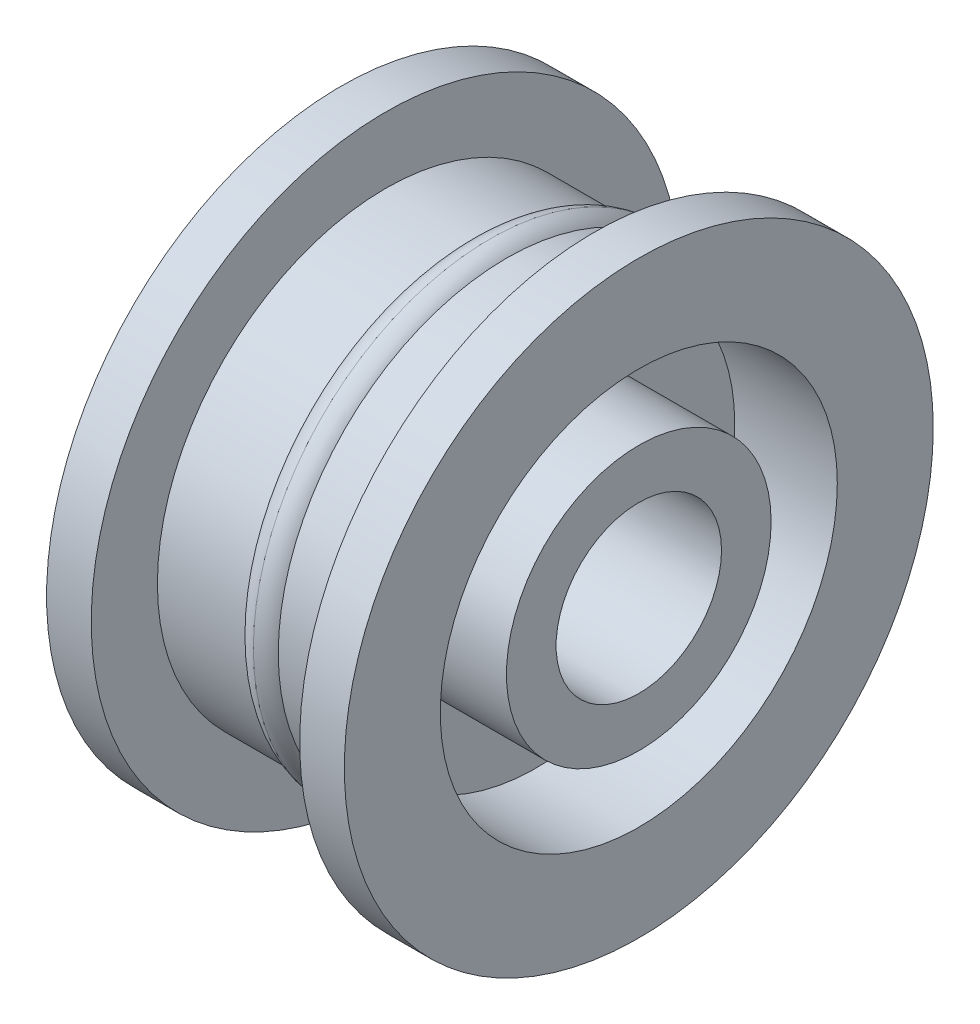
ISO-10303-21;
HEADER;
FILE_DESCRIPTION(('STEP AP214'),'2;1');
FILE_NAME('part.step','',(''),(''),'','','');
FILE_SCHEMA(('AUTOMOTIVE_DESIGN { 1 0 10303 214 1 1 1 1 }'));
ENDSEC;
DATA;
#1=APPLICATION_CONTEXT('core data for automotive mechanical design processes');
#2=APPLICATION_PROTOCOL_DEFINITION('international standard','automotive_design',2000,#1);
#3=PRODUCT_CONTEXT('',#1,'mechanical');
#4=PRODUCT('Part','Part','',(#3));
#5=PRODUCT_RELATED_PRODUCT_CATEGORY('part','',(#4));
#6=PRODUCT_DEFINITION_FORMATION('','',#4);
#7=PRODUCT_DEFINITION_CONTEXT('part definition',#1,'design');
#8=PRODUCT_DEFINITION('design','',#6,#7);
#9=PRODUCT_DEFINITION_SHAPE('','',#8);
#10=(LENGTH_UNIT() NAMED_UNIT(*) SI_UNIT(.MILLI.,.METRE.));
#11=(NAMED_UNIT(*) PLANE_ANGLE_UNIT() SI_UNIT($,.RADIAN.));
#12=(NAMED_UNIT(*) SI_UNIT($,.STERADIAN.) SOLID_ANGLE_UNIT());
#13=UNCERTAINTY_MEASURE_WITH_UNIT(LENGTH_MEASURE(1.E-05),#10,'distance_accuracy_value','');
#14=(GEOMETRIC_REPRESENTATION_CONTEXT(3) GLOBAL_UNCERTAINTY_ASSIGNED_CONTEXT((#13)) GLOBAL_UNIT_ASSIGNED_CONTEXT((#10,
#11,#12)) REPRESENTATION_CONTEXT('',''));
#15=CARTESIAN_POINT('',(0.,0.,0.));
#16=DIRECTION('',(0.,0.,1.));
#17=DIRECTION('',(1.,0.,0.));
#18=AXIS2_PLACEMENT_3D('',#15,#16,#17);
#19=CARTESIAN_POINT('',(0.,0.,0.));
#20=DIRECTION('',(1.,0.,0.));
#21=DIRECTION('',(0.,0.,-1.));
#22=AXIS2_PLACEMENT_3D('',#19,#20,#21);
#23=CYLINDRICAL_SURFACE('',#22,13.8);
#24=CARTESIAN_POINT('',(6.29999999999997,0.,0.));
#25=DIRECTION('',(1.,0.,0.));
#26=DIRECTION('',(0.,0.,-1.));
#27=AXIS2_PLACEMENT_3D('',#24,#25,#26);
#28=CIRCLE('',#27,13.8);
#29=CARTESIAN_POINT('',(6.29999999999997,0.,-13.8));
#30=VERTEX_POINT('',#29);
#31=EDGE_CURVE('E64',#30,#30,#28,.T.);
#32=ORIENTED_EDGE('',*,*,#31,.F.);
#33=EDGE_LOOP('',(#32));
#34=FACE_BOUND('',#33,.T.);
#35=CARTESIAN_POINT('',(1.00623306791414,0.,0.));
#36=DIRECTION('',(-1.,0.,0.));
#37=DIRECTION('',(0.,0.,1.));
#38=AXIS2_PLACEMENT_3D('',#35,#36,#37);
#39=CIRCLE('',#38,13.8);
#40=CARTESIAN_POINT('',(1.00623306791414,0.,13.8));
#41=VERTEX_POINT('',#40);
#42=EDGE_CURVE('E38',#41,#41,#39,.F.);
#43=ORIENTED_EDGE('',*,*,#42,.T.);
#44=EDGE_LOOP('',(#43));
#45=FACE_BOUND('',#44,.T.);
#46=ADVANCED_FACE('F34',(#34,#45),#23,.T.);
#47=CARTESIAN_POINT('',(-6.29999999999997,0.,0.));
#48=DIRECTION('',(1.,0.,0.));
#49=DIRECTION('',(0.,0.,-1.));
#50=AXIS2_PLACEMENT_3D('',#47,#48,#49);
#51=CIRCLE('',#50,13.8);
#52=CARTESIAN_POINT('',(-6.29999999999997,0.,-13.8));
#53=VERTEX_POINT('',#52);
#54=EDGE_CURVE('E56',#53,#53,#51,.T.);
#55=ORIENTED_EDGE('',*,*,#54,.T.);
#56=EDGE_LOOP('',(#55));
#57=FACE_BOUND('',#56,.T.);
#58=CARTESIAN_POINT('',(-1.00623306791414,0.,0.));
#59=DIRECTION('',(1.,0.,0.));
#60=DIRECTION('',(0.,0.,-1.));
#61=AXIS2_PLACEMENT_3D('',#58,#59,#60);
#62=CIRCLE('',#61,13.8);
#63=CARTESIAN_POINT('',(-1.00623306791414,0.,-13.8));
#64=VERTEX_POINT('',#63);
#65=EDGE_CURVE('E50',#64,#64,#62,.F.);
#66=ORIENTED_EDGE('',*,*,#65,.T.);
#67=EDGE_LOOP('',(#66));
#68=FACE_BOUND('',#67,.T.);
#69=ADVANCED_FACE('F120',(#57,#68),#23,.T.);
#70=CARTESIAN_POINT('',(-6.29999999999997,17.8,0.));
#71=DIRECTION('',(1.,0.,0.));
#72=DIRECTION('',(0.,0.,-1.));
#73=AXIS2_PLACEMENT_3D('',#70,#71,#72);
#74=PLANE('',#73);
#75=CARTESIAN_POINT('',(-6.29999999999997,0.,0.));
#76=DIRECTION('',(1.,0.,0.));
#77=DIRECTION('',(0.,0.,-1.));
#78=AXIS2_PLACEMENT_3D('',#75,#76,#77);
#79=CIRCLE('',#78,17.8);
#80=CARTESIAN_POINT('',(-6.29999999999997,0.,-17.8));
#81=VERTEX_POINT('',#80);
#82=EDGE_CURVE('E10',#81,#81,#79,.T.);
#83=ORIENTED_EDGE('',*,*,#82,.T.);
#84=EDGE_LOOP('',(#83));
#85=FACE_BOUND('',#84,.T.);
#86=ORIENTED_EDGE('',*,*,#54,.F.);
#87=EDGE_LOOP('',(#86));
#88=FACE_BOUND('',#87,.T.);
#89=ADVANCED_FACE('F36',(#85,#88),#74,.T.);
#90=CARTESIAN_POINT('',(0.,0.,0.));
#91=DIRECTION('',(1.,0.,0.));
#92=DIRECTION('',(0.,0.,-1.));
#93=AXIS2_PLACEMENT_3D('',#90,#91,#92);
#94=CYLINDRICAL_SURFACE('',#93,17.8);
#95=CARTESIAN_POINT('',(-9.00000000000001,0.,0.));
#96=DIRECTION('',(1.,0.,0.));
#97=DIRECTION('',(0.,0.,-1.));
#98=AXIS2_PLACEMENT_3D('',#95,#96,#97);
#99=CIRCLE('',#98,17.8);
#100=CARTESIAN_POINT('',(-9.00000000000001,0.,-17.8));
#101=VERTEX_POINT('',#100);
#102=EDGE_CURVE('E42',#101,#101,#99,.T.);
#103=ORIENTED_EDGE('',*,*,#102,.T.);
#104=EDGE_LOOP('',(#103));
#105=FACE_BOUND('',#104,.T.);
#106=ORIENTED_EDGE('',*,*,#82,.F.);
#107=EDGE_LOOP('',(#106));
#108=FACE_BOUND('',#107,.T.);
#109=ADVANCED_FACE('F117',(#105,#108),#94,.T.);
#110=CARTESIAN_POINT('',(-9.00000000000001,12.,0.));
#111=DIRECTION('',(-1.,0.,0.));
#112=DIRECTION('',(0.,0.,1.));
#113=AXIS2_PLACEMENT_3D('',#110,#111,#112);
#114=PLANE('',#113);
#115=CARTESIAN_POINT('',(-9.00000000000001,0.,0.));
#116=DIRECTION('',(1.,0.,0.));
#117=DIRECTION('',(0.,0.,-1.));
#118=AXIS2_PLACEMENT_3D('',#115,#116,#117);
#119=CIRCLE('',#118,12.);
#120=CARTESIAN_POINT('',(-9.00000000000001,0.,-12.));
#121=VERTEX_POINT('',#120);
#122=EDGE_CURVE('E47',#121,#121,#119,.T.);
#123=ORIENTED_EDGE('',*,*,#122,.T.);
#124=EDGE_LOOP('',(#123));
#125=FACE_BOUND('',#124,.T.);
#126=ORIENTED_EDGE('',*,*,#102,.F.);
#127=EDGE_LOOP('',(#126));
#128=FACE_BOUND('',#127,.T.);
#129=ADVANCED_FACE('F102',(#125,#128),#114,.T.);
#130=CARTESIAN_POINT('',(0.,0.,0.));
#131=DIRECTION('',(1.,0.,0.));
#132=DIRECTION('',(0.,0.,-1.));
#133=AXIS2_PLACEMENT_3D('',#130,#131,#132);
#134=CYLINDRICAL_SURFACE('',#133,12.);
#135=CARTESIAN_POINT('',(-2.80000000000002,0.,0.));
#136=DIRECTION('',(1.,0.,0.));
#137=DIRECTION('',(0.,0.,-1.));
#138=AXIS2_PLACEMENT_3D('',#135,#136,#137);
#139=CIRCLE('',#138,12.);
#140=CARTESIAN_POINT('',(-2.80000000000002,0.,-12.));
#141=VERTEX_POINT('',#140);
#142=EDGE_CURVE('E97',#141,#141,#139,.T.);
#143=ORIENTED_EDGE('',*,*,#142,.T.);
#144=EDGE_LOOP('',(#143));
#145=FACE_BOUND('',#144,.T.);
#146=ORIENTED_EDGE('',*,*,#122,.F.);
#147=EDGE_LOOP('',(#146));
#148=FACE_BOUND('',#147,.T.);
#149=ADVANCED_FACE('F105',(#145,#148),#134,.F.);
#150=CARTESIAN_POINT('',(-2.80000000000002,8.00000000000001,0.));
#151=DIRECTION('',(-1.,0.,0.));
#152=DIRECTION('',(0.,0.,1.));
#153=AXIS2_PLACEMENT_3D('',#150,#151,#152);
#154=PLANE('',#153);
#155=CARTESIAN_POINT('',(-2.80000000000002,0.,0.));
#156=DIRECTION('',(1.,0.,0.));
#157=DIRECTION('',(0.,0.,-1.));
#158=AXIS2_PLACEMENT_3D('',#155,#156,#157);
#159=CIRCLE('',#158,8.);
#160=CARTESIAN_POINT('',(-2.80000000000002,0.,-7.99999999999999));
#161=VERTEX_POINT('',#160);
#162=EDGE_CURVE('E94',#161,#161,#159,.T.);
#163=ORIENTED_EDGE('',*,*,#162,.T.);
#164=EDGE_LOOP('',(#163));
#165=FACE_BOUND('',#164,.T.);
#166=ORIENTED_EDGE('',*,*,#142,.F.);
#167=EDGE_LOOP('',(#166));
#168=FACE_BOUND('',#167,.T.);
#169=ADVANCED_FACE('F107',(#165,#168),#154,.T.);
#170=CARTESIAN_POINT('',(0.,0.,0.));
#171=DIRECTION('',(1.,0.,0.));
#172=DIRECTION('',(0.,0.,-1.));
#173=AXIS2_PLACEMENT_3D('',#170,#171,#172);
#174=CYLINDRICAL_SURFACE('',#173,8.);
#175=CARTESIAN_POINT('',(-9.00000000000001,0.,0.));
#176=DIRECTION('',(1.,0.,0.));
#177=DIRECTION('',(0.,0.,-1.));
#178=AXIS2_PLACEMENT_3D('',#175,#176,#177);
#179=CIRCLE('',#178,8.);
#180=CARTESIAN_POINT('',(-9.00000000000001,0.,-7.99999999999999));
#181=VERTEX_POINT('',#180);
#182=EDGE_CURVE('E91',#181,#181,#179,.T.);
#183=ORIENTED_EDGE('',*,*,#182,.T.);
#184=EDGE_LOOP('',(#183));
#185=FACE_BOUND('',#184,.T.);
#186=ORIENTED_EDGE('',*,*,#162,.F.);
#187=EDGE_LOOP('',(#186));
#188=FACE_BOUND('',#187,.T.);
#189=ADVANCED_FACE('F114',(#185,#188),#174,.T.);
#190=CARTESIAN_POINT('',(-9.00000000000001,5.00000000000003,0.));
#191=DIRECTION('',(-1.,0.,0.));
#192=DIRECTION('',(0.,0.,1.));
#193=AXIS2_PLACEMENT_3D('',#190,#191,#192);
#194=PLANE('',#193);
#195=CARTESIAN_POINT('',(-9.00000000000001,0.,0.));
#196=DIRECTION('',(1.,0.,0.));
#197=DIRECTION('',(0.,0.,-1.));
#198=AXIS2_PLACEMENT_3D('',#195,#196,#197);
#199=CIRCLE('',#198,5.);
#200=CARTESIAN_POINT('',(-9.00000000000001,0.,-4.99999999999999));
#201=VERTEX_POINT('',#200);
#202=EDGE_CURVE('E88',#201,#201,#199,.T.);
#203=ORIENTED_EDGE('',*,*,#202,.T.);
#204=EDGE_LOOP('',(#203));
#205=FACE_BOUND('',#204,.T.);
#206=ORIENTED_EDGE('',*,*,#182,.F.);
#207=EDGE_LOOP('',(#206));
#208=FACE_BOUND('',#207,.T.);
#209=ADVANCED_FACE('F164',(#205,#208),#194,.T.);
#210=CARTESIAN_POINT('',(0.,0.,0.));
#211=DIRECTION('',(1.,0.,0.));
#212=DIRECTION('',(0.,0.,-1.));
#213=AXIS2_PLACEMENT_3D('',#210,#211,#212);
#214=CYLINDRICAL_SURFACE('',#213,5.);
#215=CARTESIAN_POINT('',(9.00000000000001,0.,0.));
#216=DIRECTION('',(1.,0.,0.));
#217=DIRECTION('',(0.,0.,-1.));
#218=AXIS2_PLACEMENT_3D('',#215,#216,#217);
#219=CIRCLE('',#218,5.);
#220=CARTESIAN_POINT('',(9.00000000000001,0.,-5.));
#221=VERTEX_POINT('',#220);
#222=EDGE_CURVE('E85',#221,#221,#219,.T.);
#223=ORIENTED_EDGE('',*,*,#222,.T.);
#224=EDGE_LOOP('',(#223));
#225=FACE_BOUND('',#224,.T.);
#226=ORIENTED_EDGE('',*,*,#202,.F.);
#227=EDGE_LOOP('',(#226));
#228=FACE_BOUND('',#227,.T.);
#229=ADVANCED_FACE('F160',(#225,#228),#214,.F.);
#230=CARTESIAN_POINT('',(9.00000000000001,5.00000000000003,0.));
#231=DIRECTION('',(1.,0.,0.));
#232=DIRECTION('',(0.,0.,-1.));
#233=AXIS2_PLACEMENT_3D('',#230,#231,#232);
#234=PLANE('',#233);
#235=CARTESIAN_POINT('',(9.00000000000001,0.,0.));
#236=DIRECTION('',(1.,0.,0.));
#237=DIRECTION('',(0.,0.,-1.));
#238=AXIS2_PLACEMENT_3D('',#235,#236,#237);
#239=CIRCLE('',#238,8.);
#240=CARTESIAN_POINT('',(9.00000000000001,0.,-8.));
#241=VERTEX_POINT('',#240);
#242=EDGE_CURVE('E82',#241,#241,#239,.T.);
#243=ORIENTED_EDGE('',*,*,#242,.T.);
#244=EDGE_LOOP('',(#243));
#245=FACE_BOUND('',#244,.T.);
#246=ORIENTED_EDGE('',*,*,#222,.F.);
#247=EDGE_LOOP('',(#246));
#248=FACE_BOUND('',#247,.T.);
#249=ADVANCED_FACE('F156',(#245,#248),#234,.T.);
#250=CARTESIAN_POINT('',(0.,0.,0.));
#251=DIRECTION('',(1.,0.,0.));
#252=DIRECTION('',(0.,0.,-1.));
#253=AXIS2_PLACEMENT_3D('',#250,#251,#252);
#254=CYLINDRICAL_SURFACE('',#253,8.);
#255=CARTESIAN_POINT('',(2.80000000000002,0.,0.));
#256=DIRECTION('',(1.,0.,0.));
#257=DIRECTION('',(0.,0.,-1.));
#258=AXIS2_PLACEMENT_3D('',#255,#256,#257);
#259=CIRCLE('',#258,8.);
#260=CARTESIAN_POINT('',(2.80000000000002,0.,-8.));
#261=VERTEX_POINT('',#260);
#262=EDGE_CURVE('E79',#261,#261,#259,.T.);
#263=ORIENTED_EDGE('',*,*,#262,.T.);
#264=EDGE_LOOP('',(#263));
#265=FACE_BOUND('',#264,.T.);
#266=ORIENTED_EDGE('',*,*,#242,.F.);
#267=EDGE_LOOP('',(#266));
#268=FACE_BOUND('',#267,.T.);
#269=ADVANCED_FACE('F152',(#265,#268),#254,.T.);
#270=CARTESIAN_POINT('',(2.80000000000002,7.99999999999998,0.));
#271=DIRECTION('',(1.,0.,0.));
#272=DIRECTION('',(0.,0.,-1.));
#273=AXIS2_PLACEMENT_3D('',#270,#271,#272);
#274=PLANE('',#273);
#275=CARTESIAN_POINT('',(2.80000000000002,0.,0.));
#276=DIRECTION('',(1.,0.,0.));
#277=DIRECTION('',(0.,0.,-1.));
#278=AXIS2_PLACEMENT_3D('',#275,#276,#277);
#279=CIRCLE('',#278,12.);
#280=CARTESIAN_POINT('',(2.80000000000002,0.,-12.));
#281=VERTEX_POINT('',#280);
#282=EDGE_CURVE('E76',#281,#281,#279,.T.);
#283=ORIENTED_EDGE('',*,*,#282,.T.);
#284=EDGE_LOOP('',(#283));
#285=FACE_BOUND('',#284,.T.);
#286=ORIENTED_EDGE('',*,*,#262,.F.);
#287=EDGE_LOOP('',(#286));
#288=FACE_BOUND('',#287,.T.);
#289=ADVANCED_FACE('F148',(#285,#288),#274,.T.);
#290=CARTESIAN_POINT('',(0.,0.,0.));
#291=DIRECTION('',(1.,0.,0.));
#292=DIRECTION('',(0.,0.,-1.));
#293=AXIS2_PLACEMENT_3D('',#290,#291,#292);
#294=CYLINDRICAL_SURFACE('',#293,12.);
#295=CARTESIAN_POINT('',(9.00000000000001,0.,0.));
#296=DIRECTION('',(1.,0.,0.));
#297=DIRECTION('',(0.,0.,-1.));
#298=AXIS2_PLACEMENT_3D('',#295,#296,#297);
#299=CIRCLE('',#298,12.);
#300=CARTESIAN_POINT('',(9.00000000000001,0.,-12.));
#301=VERTEX_POINT('',#300);
#302=EDGE_CURVE('E73',#301,#301,#299,.T.);
#303=ORIENTED_EDGE('',*,*,#302,.T.);
#304=EDGE_LOOP('',(#303));
#305=FACE_BOUND('',#304,.T.);
#306=ORIENTED_EDGE('',*,*,#282,.F.);
#307=EDGE_LOOP('',(#306));
#308=FACE_BOUND('',#307,.T.);
#309=ADVANCED_FACE('F144',(#305,#308),#294,.F.);
#310=CARTESIAN_POINT('',(9.00000000000001,12.,0.));
#311=DIRECTION('',(1.,0.,0.));
#312=DIRECTION('',(0.,0.,-1.));
#313=AXIS2_PLACEMENT_3D('',#310,#311,#312);
#314=PLANE('',#313);
#315=CARTESIAN_POINT('',(9.00000000000001,0.,0.));
#316=DIRECTION('',(1.,0.,0.));
#317=DIRECTION('',(0.,0.,-1.));
#318=AXIS2_PLACEMENT_3D('',#315,#316,#317);
#319=CIRCLE('',#318,17.8);
#320=CARTESIAN_POINT('',(9.00000000000001,0.,-17.8));
#321=VERTEX_POINT('',#320);
#322=EDGE_CURVE('E70',#321,#321,#319,.T.);
#323=ORIENTED_EDGE('',*,*,#322,.T.);
#324=EDGE_LOOP('',(#323));
#325=FACE_BOUND('',#324,.T.);
#326=ORIENTED_EDGE('',*,*,#302,.F.);
#327=EDGE_LOOP('',(#326));
#328=FACE_BOUND('',#327,.T.);
#329=ADVANCED_FACE('F140',(#325,#328),#314,.T.);
#330=CARTESIAN_POINT('',(0.,0.,0.));
#331=DIRECTION('',(1.,0.,0.));
#332=DIRECTION('',(0.,0.,-1.));
#333=AXIS2_PLACEMENT_3D('',#330,#331,#332);
#334=CYLINDRICAL_SURFACE('',#333,17.8);
#335=CARTESIAN_POINT('',(6.29999999999997,0.,0.));
#336=DIRECTION('',(1.,0.,0.));
#337=DIRECTION('',(0.,0.,-1.));
#338=AXIS2_PLACEMENT_3D('',#335,#336,#337);
#339=CIRCLE('',#338,17.8);
#340=CARTESIAN_POINT('',(6.29999999999997,0.,-17.8));
#341=VERTEX_POINT('',#340);
#342=EDGE_CURVE('E67',#341,#341,#339,.T.);
#343=ORIENTED_EDGE('',*,*,#342,.T.);
#344=EDGE_LOOP('',(#343));
#345=FACE_BOUND('',#344,.T.);
#346=ORIENTED_EDGE('',*,*,#322,.F.);
#347=EDGE_LOOP('',(#346));
#348=FACE_BOUND('',#347,.T.);
#349=ADVANCED_FACE('F136',(#345,#348),#334,.T.);
#350=CARTESIAN_POINT('',(6.29999999999997,17.8,0.));
#351=DIRECTION('',(-1.,0.,0.));
#352=DIRECTION('',(0.,0.,1.));
#353=AXIS2_PLACEMENT_3D('',#350,#351,#352);
#354=PLANE('',#353);
#355=ORIENTED_EDGE('',*,*,#31,.T.);
#356=EDGE_LOOP('',(#355));
#357=FACE_BOUND('',#356,.T.);
#358=ORIENTED_EDGE('',*,*,#342,.F.);
#359=EDGE_LOOP('',(#358));
#360=FACE_BOUND('',#359,.T.);
#361=ADVANCED_FACE('F133',(#357,#360),#354,.T.);
#362=CARTESIAN_POINT('',(-0.115787977684301,0.,0.));
#363=DIRECTION('',(-1.,0.,0.));
#364=DIRECTION('',(0.,0.,1.));
#365=AXIS2_PLACEMENT_3D('',#362,#363,#364);
#366=TOROIDAL_SURFACE('',#365,12.8044756290104,1.5);
#367=ORIENTED_EDGE('',*,*,#42,.F.);
#368=EDGE_LOOP('',(#367));
#369=FACE_BOUND('',#368,.T.);
#370=CARTESIAN_POINT('',(0.,0.,0.));
#371=DIRECTION('',(-1.,0.,0.));
#372=DIRECTION('',(0.,0.,1.));
#373=AXIS2_PLACEMENT_3D('',#370,#371,#372);
#374=CIRCLE('',#373,14.3);
#375=CARTESIAN_POINT('',(0.,0.,14.3));
#376=VERTEX_POINT('',#375);
#377=EDGE_CURVE('E52',#376,#376,#374,.T.);
#378=ORIENTED_EDGE('',*,*,#377,.F.);
#379=EDGE_LOOP('',(#378));
#380=FACE_BOUND('',#379,.T.);
#381=ADVANCED_FACE('F131',(#369,#380),#366,.T.);
#382=CARTESIAN_POINT('',(0.115787977684301,0.,0.));
#383=DIRECTION('',(-1.,0.,0.));
#384=DIRECTION('',(0.,0.,1.));
#385=AXIS2_PLACEMENT_3D('',#382,#383,#384);
#386=TOROIDAL_SURFACE('',#385,12.8044756290104,1.5);
#387=ORIENTED_EDGE('',*,*,#65,.F.);
#388=EDGE_LOOP('',(#387));
#389=FACE_BOUND('',#388,.T.);
#390=ORIENTED_EDGE('',*,*,#377,.T.);
#391=EDGE_LOOP('',(#390));
#392=FACE_BOUND('',#391,.T.);
#393=ADVANCED_FACE('F224',(#389,#392),#386,.T.);
#394=CLOSED_SHELL('',(#46,#69,#89,#109,#129,#149,#169,#189,#209,#229,#249,#269,#289,#309,#329,
#349,#361,#381,#393));
#395=MANIFOLD_SOLID_BREP('B2',#394);
#396=ADVANCED_BREP_SHAPE_REPRESENTATION('',(#18,#395),#14);
#397=SHAPE_DEFINITION_REPRESENTATION(#9,#396);
ENDSEC;
END-ISO-10303-21;
